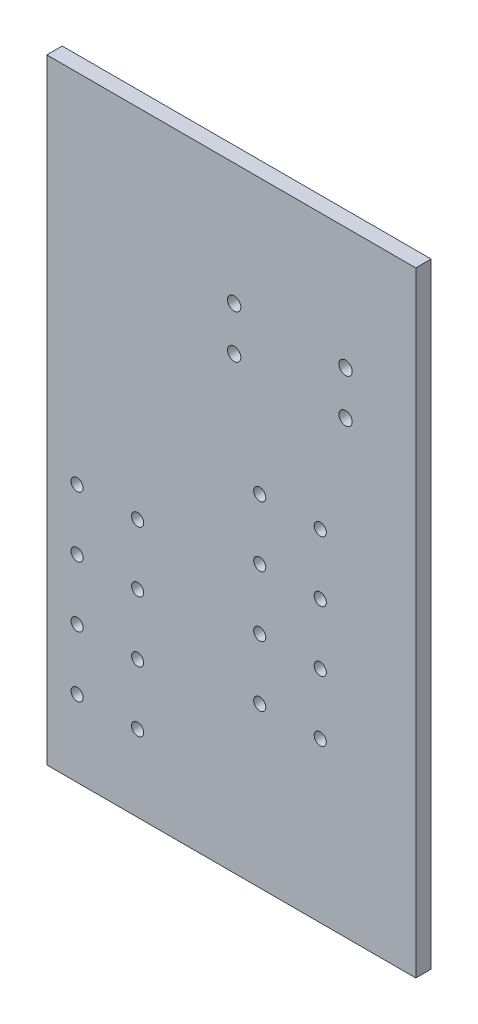
ISO-10303-21;
HEADER;
FILE_DESCRIPTION(('STEP AP214'),'2;1');
FILE_NAME('part.step','',(''),(''),'','','');
FILE_SCHEMA(('AUTOMOTIVE_DESIGN { 1 0 10303 214 1 1 1 1 }'));
ENDSEC;
DATA;
#1=APPLICATION_CONTEXT('core data for automotive mechanical design processes');
#2=APPLICATION_PROTOCOL_DEFINITION('international standard','automotive_design',2000,#1);
#3=PRODUCT_CONTEXT('',#1,'mechanical');
#4=PRODUCT('Part','Part','',(#3));
#5=PRODUCT_RELATED_PRODUCT_CATEGORY('part','',(#4));
#6=PRODUCT_DEFINITION_FORMATION('','',#4);
#7=PRODUCT_DEFINITION_CONTEXT('part definition',#1,'design');
#8=PRODUCT_DEFINITION('design','',#6,#7);
#9=PRODUCT_DEFINITION_SHAPE('','',#8);
#10=(LENGTH_UNIT() NAMED_UNIT(*) SI_UNIT(.MILLI.,.METRE.));
#11=(NAMED_UNIT(*) PLANE_ANGLE_UNIT() SI_UNIT($,.RADIAN.));
#12=(NAMED_UNIT(*) SI_UNIT($,.STERADIAN.) SOLID_ANGLE_UNIT());
#13=UNCERTAINTY_MEASURE_WITH_UNIT(LENGTH_MEASURE(1.E-05),#10,'distance_accuracy_value','');
#14=(GEOMETRIC_REPRESENTATION_CONTEXT(3) GLOBAL_UNCERTAINTY_ASSIGNED_CONTEXT((#13)) GLOBAL_UNIT_ASSIGNED_CONTEXT((#10,
#11,#12)) REPRESENTATION_CONTEXT('',''));
#15=CARTESIAN_POINT('',(0.,0.,0.));
#16=DIRECTION('',(0.,0.,1.));
#17=DIRECTION('',(1.,0.,0.));
#18=AXIS2_PLACEMENT_3D('',#15,#16,#17);
#19=CARTESIAN_POINT('',(76.2,127.,6.35));
#20=DIRECTION('',(-1.,0.,0.));
#21=DIRECTION('',(0.,-1.,0.));
#22=AXIS2_PLACEMENT_3D('',#19,#20,#21);
#23=PLANE('',#22);
#24=DIRECTION('',(0.,1.,0.));
#25=VECTOR('',#24,1.);
#26=CARTESIAN_POINT('',(76.2,127.,0.));
#27=LINE('',#26,#25);
#28=CARTESIAN_POINT('',(76.2,-127.,0.));
#29=VERTEX_POINT('',#28);
#30=CARTESIAN_POINT('',(76.2,127.,0.));
#31=VERTEX_POINT('',#30);
#32=EDGE_CURVE('E96',#29,#31,#27,.T.);
#33=ORIENTED_EDGE('',*,*,#32,.T.);
#34=DIRECTION('',(0.,0.,-1.));
#35=VECTOR('',#34,1.);
#36=CARTESIAN_POINT('',(76.2,127.,6.35));
#37=LINE('',#36,#35);
#38=CARTESIAN_POINT('',(76.2,127.,6.35));
#39=VERTEX_POINT('',#38);
#40=EDGE_CURVE('E11',#39,#31,#37,.T.);
#41=ORIENTED_EDGE('',*,*,#40,.F.);
#42=DIRECTION('',(0.,1.,0.));
#43=VECTOR('',#42,1.);
#44=CARTESIAN_POINT('',(76.2,127.,6.35));
#45=LINE('',#44,#43);
#46=CARTESIAN_POINT('',(76.2,-127.,6.35));
#47=VERTEX_POINT('',#46);
#48=EDGE_CURVE('E84',#47,#39,#45,.T.);
#49=ORIENTED_EDGE('',*,*,#48,.F.);
#50=DIRECTION('',(0.,0.,-1.));
#51=VECTOR('',#50,1.);
#52=CARTESIAN_POINT('',(76.2,-127.,6.35));
#53=LINE('',#52,#51);
#54=EDGE_CURVE('E92',#47,#29,#53,.T.);
#55=ORIENTED_EDGE('',*,*,#54,.T.);
#56=EDGE_LOOP('',(#33,#41,#49,#55));
#57=FACE_BOUND('',#56,.T.);
#58=ADVANCED_FACE('F33',(#57),#23,.F.);
#59=CARTESIAN_POINT('',(-76.2,127.,6.35));
#60=DIRECTION('',(0.,-1.,0.));
#61=DIRECTION('',(0.,0.,-1.));
#62=AXIS2_PLACEMENT_3D('',#59,#60,#61);
#63=PLANE('',#62);
#64=DIRECTION('',(-1.,0.,0.));
#65=VECTOR('',#64,1.);
#66=CARTESIAN_POINT('',(-76.2,127.,0.));
#67=LINE('',#66,#65);
#68=CARTESIAN_POINT('',(-76.2,127.,0.));
#69=VERTEX_POINT('',#68);
#70=EDGE_CURVE('E88',#31,#69,#67,.T.);
#71=ORIENTED_EDGE('',*,*,#70,.T.);
#72=DIRECTION('',(0.,0.,-1.));
#73=VECTOR('',#72,1.);
#74=CARTESIAN_POINT('',(-76.2,127.,6.35));
#75=LINE('',#74,#73);
#76=CARTESIAN_POINT('',(-76.2,127.,6.35));
#77=VERTEX_POINT('',#76);
#78=EDGE_CURVE('E41',#77,#69,#75,.T.);
#79=ORIENTED_EDGE('',*,*,#78,.F.);
#80=DIRECTION('',(-1.,0.,0.));
#81=VECTOR('',#80,1.);
#82=CARTESIAN_POINT('',(-76.2,127.,6.35));
#83=LINE('',#82,#81);
#84=EDGE_CURVE('E79',#39,#77,#83,.T.);
#85=ORIENTED_EDGE('',*,*,#84,.F.);
#86=ORIENTED_EDGE('',*,*,#40,.T.);
#87=EDGE_LOOP('',(#71,#79,#85,#86));
#88=FACE_BOUND('',#87,.T.);
#89=ADVANCED_FACE('F87',(#88),#63,.F.);
#90=CARTESIAN_POINT('',(-76.2,127.,6.35));
#91=DIRECTION('',(1.,0.,0.));
#92=DIRECTION('',(0.,1.,0.));
#93=AXIS2_PLACEMENT_3D('',#90,#91,#92);
#94=PLANE('',#93);
#95=DIRECTION('',(0.,-1.,0.));
#96=VECTOR('',#95,1.);
#97=CARTESIAN_POINT('',(-76.2,127.,0.));
#98=LINE('',#97,#96);
#99=CARTESIAN_POINT('',(-76.2,-127.,0.));
#100=VERTEX_POINT('',#99);
#101=EDGE_CURVE('E66',#69,#100,#98,.T.);
#102=ORIENTED_EDGE('',*,*,#101,.T.);
#103=DIRECTION('',(0.,0.,-1.));
#104=VECTOR('',#103,1.);
#105=CARTESIAN_POINT('',(-76.2,-127.,6.35));
#106=LINE('',#105,#104);
#107=CARTESIAN_POINT('',(-76.2,-127.,6.35));
#108=VERTEX_POINT('',#107);
#109=EDGE_CURVE('E89',#108,#100,#106,.T.);
#110=ORIENTED_EDGE('',*,*,#109,.F.);
#111=DIRECTION('',(0.,-1.,0.));
#112=VECTOR('',#111,1.);
#113=CARTESIAN_POINT('',(-76.2,127.,6.35));
#114=LINE('',#113,#112);
#115=EDGE_CURVE('E82',#77,#108,#114,.T.);
#116=ORIENTED_EDGE('',*,*,#115,.F.);
#117=ORIENTED_EDGE('',*,*,#78,.T.);
#118=EDGE_LOOP('',(#102,#110,#116,#117));
#119=FACE_BOUND('',#118,.T.);
#120=ADVANCED_FACE('F90',(#119),#94,.F.);
#121=CARTESIAN_POINT('',(-76.2,-127.,6.35));
#122=DIRECTION('',(0.,1.,0.));
#123=DIRECTION('',(0.,0.,1.));
#124=AXIS2_PLACEMENT_3D('',#121,#122,#123);
#125=PLANE('',#124);
#126=DIRECTION('',(1.,0.,0.));
#127=VECTOR('',#126,1.);
#128=CARTESIAN_POINT('',(-76.2,-127.,0.));
#129=LINE('',#128,#127);
#130=EDGE_CURVE('E72',#100,#29,#129,.T.);
#131=ORIENTED_EDGE('',*,*,#130,.T.);
#132=ORIENTED_EDGE('',*,*,#54,.F.);
#133=DIRECTION('',(1.,0.,0.));
#134=VECTOR('',#133,1.);
#135=CARTESIAN_POINT('',(-76.2,-127.,6.35));
#136=LINE('',#135,#134);
#137=EDGE_CURVE('E49',#108,#47,#136,.T.);
#138=ORIENTED_EDGE('',*,*,#137,.F.);
#139=ORIENTED_EDGE('',*,*,#109,.T.);
#140=EDGE_LOOP('',(#131,#132,#138,#139));
#141=FACE_BOUND('',#140,.T.);
#142=ADVANCED_FACE('F104',(#141),#125,.F.);
#143=CARTESIAN_POINT('',(0.,0.,6.35));
#144=DIRECTION('',(0.,0.,1.));
#145=DIRECTION('',(1.,0.,0.));
#146=AXIS2_PLACEMENT_3D('',#143,#144,#145);
#147=PLANE('',#146);
#148=CARTESIAN_POINT('',(1.180499962001,76.7624024018385,6.35));
#149=DIRECTION('',(0.,0.,1.));
#150=DIRECTION('',(1.,0.,0.));
#151=AXIS2_PLACEMENT_3D('',#148,#149,#150);
#152=CIRCLE('',#151,2.75);
#153=CARTESIAN_POINT('',(3.930499962001,76.7624024018385,6.35));
#154=VERTEX_POINT('',#153);
#155=EDGE_CURVE('E224',#154,#154,#152,.F.);
#156=ORIENTED_EDGE('',*,*,#155,.T.);
#157=EDGE_LOOP('',(#156));
#158=FACE_BOUND('',#157,.T.);
#159=CARTESIAN_POINT('',(47.180499962001,76.7624024018386,6.35));
#160=DIRECTION('',(0.,0.,1.));
#161=DIRECTION('',(1.,0.,0.));
#162=AXIS2_PLACEMENT_3D('',#159,#160,#161);
#163=CIRCLE('',#162,2.74999999999999);
#164=CARTESIAN_POINT('',(49.930499962001,76.7624024018386,6.35));
#165=VERTEX_POINT('',#164);
#166=EDGE_CURVE('E218',#165,#165,#163,.F.);
#167=ORIENTED_EDGE('',*,*,#166,.T.);
#168=EDGE_LOOP('',(#167));
#169=FACE_BOUND('',#168,.T.);
#170=CARTESIAN_POINT('',(1.180499962001,58.7624024018386,6.35));
#171=DIRECTION('',(0.,0.,1.));
#172=DIRECTION('',(1.,0.,0.));
#173=AXIS2_PLACEMENT_3D('',#170,#171,#172);
#174=CIRCLE('',#173,2.75);
#175=CARTESIAN_POINT('',(3.930499962001,58.7624024018386,6.35));
#176=VERTEX_POINT('',#175);
#177=EDGE_CURVE('E212',#176,#176,#174,.F.);
#178=ORIENTED_EDGE('',*,*,#177,.T.);
#179=EDGE_LOOP('',(#178));
#180=FACE_BOUND('',#179,.T.);
#181=CARTESIAN_POINT('',(47.180499962001,58.7624024018386,6.35));
#182=DIRECTION('',(0.,0.,1.));
#183=DIRECTION('',(1.,0.,0.));
#184=AXIS2_PLACEMENT_3D('',#181,#182,#183);
#185=CIRCLE('',#184,2.74999999999999);
#186=CARTESIAN_POINT('',(49.930499962001,58.7624024018386,6.35));
#187=VERTEX_POINT('',#186);
#188=EDGE_CURVE('E206',#187,#187,#185,.F.);
#189=ORIENTED_EDGE('',*,*,#188,.T.);
#190=EDGE_LOOP('',(#189));
#191=FACE_BOUND('',#190,.T.);
#192=CARTESIAN_POINT('',(11.7379999999995,13.8400000000015,6.35));
#193=DIRECTION('',(0.,0.,1.));
#194=DIRECTION('',(1.,0.,0.));
#195=AXIS2_PLACEMENT_3D('',#192,#193,#194);
#196=CIRCLE('',#195,2.49999999999917);
#197=CARTESIAN_POINT('',(14.2379999999987,13.8400000000015,6.35));
#198=VERTEX_POINT('',#197);
#199=EDGE_CURVE('E200',#198,#198,#196,.F.);
#200=ORIENTED_EDGE('',*,*,#199,.T.);
#201=EDGE_LOOP('',(#200));
#202=FACE_BOUND('',#201,.T.);
#203=CARTESIAN_POINT('',(36.7379999999995,13.8400000000015,6.35));
#204=DIRECTION('',(0.,0.,1.));
#205=DIRECTION('',(1.,0.,0.));
#206=AXIS2_PLACEMENT_3D('',#203,#204,#205);
#207=CIRCLE('',#206,2.49999999999917);
#208=CARTESIAN_POINT('',(39.2379999999987,13.8400000000015,6.35));
#209=VERTEX_POINT('',#208);
#210=EDGE_CURVE('E194',#209,#209,#207,.F.);
#211=ORIENTED_EDGE('',*,*,#210,.T.);
#212=EDGE_LOOP('',(#211));
#213=FACE_BOUND('',#212,.T.);
#214=CARTESIAN_POINT('',(36.7379999999995,-11.1599999999985,6.35));
#215=DIRECTION('',(0.,0.,1.));
#216=DIRECTION('',(1.,0.,0.));
#217=AXIS2_PLACEMENT_3D('',#214,#215,#216);
#218=CIRCLE('',#217,2.49999999999916);
#219=CARTESIAN_POINT('',(39.2379999999987,-11.1599999999985,6.35));
#220=VERTEX_POINT('',#219);
#221=EDGE_CURVE('E188',#220,#220,#218,.F.);
#222=ORIENTED_EDGE('',*,*,#221,.T.);
#223=EDGE_LOOP('',(#222));
#224=FACE_BOUND('',#223,.T.);
#225=CARTESIAN_POINT('',(11.7379999999995,-11.1599999999985,6.35));
#226=DIRECTION('',(0.,0.,1.));
#227=DIRECTION('',(1.,0.,0.));
#228=AXIS2_PLACEMENT_3D('',#225,#226,#227);
#229=CIRCLE('',#228,2.49999999999917);
#230=CARTESIAN_POINT('',(14.2379999999987,-11.1599999999985,6.35));
#231=VERTEX_POINT('',#230);
#232=EDGE_CURVE('E182',#231,#231,#229,.F.);
#233=ORIENTED_EDGE('',*,*,#232,.T.);
#234=EDGE_LOOP('',(#233));
#235=FACE_BOUND('',#234,.T.);
#236=CARTESIAN_POINT('',(36.7379999999995,-36.1599999999985,6.35));
#237=DIRECTION('',(0.,0.,1.));
#238=DIRECTION('',(1.,0.,0.));
#239=AXIS2_PLACEMENT_3D('',#236,#237,#238);
#240=CIRCLE('',#239,2.49999999999917);
#241=CARTESIAN_POINT('',(39.2379999999987,-36.1599999999985,6.35));
#242=VERTEX_POINT('',#241);
#243=EDGE_CURVE('E176',#242,#242,#240,.F.);
#244=ORIENTED_EDGE('',*,*,#243,.T.);
#245=EDGE_LOOP('',(#244));
#246=FACE_BOUND('',#245,.T.);
#247=CARTESIAN_POINT('',(36.7379999999995,-61.1599999999985,6.35));
#248=DIRECTION('',(0.,0.,1.));
#249=DIRECTION('',(1.,0.,0.));
#250=AXIS2_PLACEMENT_3D('',#247,#248,#249);
#251=CIRCLE('',#250,2.49999999999918);
#252=CARTESIAN_POINT('',(39.2379999999987,-61.1599999999985,6.35));
#253=VERTEX_POINT('',#252);
#254=EDGE_CURVE('E170',#253,#253,#251,.F.);
#255=ORIENTED_EDGE('',*,*,#254,.T.);
#256=EDGE_LOOP('',(#255));
#257=FACE_BOUND('',#256,.T.);
#258=CARTESIAN_POINT('',(11.7379999999995,-36.1599999999985,6.35));
#259=DIRECTION('',(0.,0.,1.));
#260=DIRECTION('',(1.,0.,0.));
#261=AXIS2_PLACEMENT_3D('',#258,#259,#260);
#262=CIRCLE('',#261,2.49999999999917);
#263=CARTESIAN_POINT('',(14.2379999999987,-36.1599999999985,6.35));
#264=VERTEX_POINT('',#263);
#265=EDGE_CURVE('E164',#264,#264,#262,.F.);
#266=ORIENTED_EDGE('',*,*,#265,.T.);
#267=EDGE_LOOP('',(#266));
#268=FACE_BOUND('',#267,.T.);
#269=CARTESIAN_POINT('',(11.7379999999995,-61.1599999999985,6.35));
#270=DIRECTION('',(0.,0.,1.));
#271=DIRECTION('',(1.,0.,0.));
#272=AXIS2_PLACEMENT_3D('',#269,#270,#271);
#273=CIRCLE('',#272,2.49999999999917);
#274=CARTESIAN_POINT('',(14.2379999999987,-61.1599999999985,6.35));
#275=VERTEX_POINT('',#274);
#276=EDGE_CURVE('E158',#275,#275,#273,.F.);
#277=ORIENTED_EDGE('',*,*,#276,.T.);
#278=EDGE_LOOP('',(#277));
#279=FACE_BOUND('',#278,.T.);
#280=CARTESIAN_POINT('',(-63.7000000000001,-95.449999999997,6.35));
#281=DIRECTION('',(0.,0.,1.));
#282=DIRECTION('',(1.,0.,0.));
#283=AXIS2_PLACEMENT_3D('',#280,#281,#282);
#284=CIRCLE('',#283,2.49999999999995);
#285=CARTESIAN_POINT('',(-61.2000000000002,-95.449999999997,6.35));
#286=VERTEX_POINT('',#285);
#287=EDGE_CURVE('E152',#286,#286,#284,.F.);
#288=ORIENTED_EDGE('',*,*,#287,.T.);
#289=EDGE_LOOP('',(#288));
#290=FACE_BOUND('',#289,.T.);
#291=CARTESIAN_POINT('',(-38.7000000000001,-95.449999999997,6.35));
#292=DIRECTION('',(0.,0.,1.));
#293=DIRECTION('',(1.,0.,0.));
#294=AXIS2_PLACEMENT_3D('',#291,#292,#293);
#295=CIRCLE('',#294,2.49999999999995);
#296=CARTESIAN_POINT('',(-36.2000000000002,-95.449999999997,6.35));
#297=VERTEX_POINT('',#296);
#298=EDGE_CURVE('E146',#297,#297,#295,.F.);
#299=ORIENTED_EDGE('',*,*,#298,.T.);
#300=EDGE_LOOP('',(#299));
#301=FACE_BOUND('',#300,.T.);
#302=CARTESIAN_POINT('',(-38.7000000000001,-70.449999999997,6.35));
#303=DIRECTION('',(0.,0.,1.));
#304=DIRECTION('',(1.,0.,0.));
#305=AXIS2_PLACEMENT_3D('',#302,#303,#304);
#306=CIRCLE('',#305,2.49999999999994);
#307=CARTESIAN_POINT('',(-36.2000000000002,-70.449999999997,6.35));
#308=VERTEX_POINT('',#307);
#309=EDGE_CURVE('E140',#308,#308,#306,.F.);
#310=ORIENTED_EDGE('',*,*,#309,.T.);
#311=EDGE_LOOP('',(#310));
#312=FACE_BOUND('',#311,.T.);
#313=CARTESIAN_POINT('',(-63.7000000000001,-70.449999999997,6.35));
#314=DIRECTION('',(0.,0.,1.));
#315=DIRECTION('',(1.,0.,0.));
#316=AXIS2_PLACEMENT_3D('',#313,#314,#315);
#317=CIRCLE('',#316,2.49999999999995);
#318=CARTESIAN_POINT('',(-61.2000000000002,-70.449999999997,6.35));
#319=VERTEX_POINT('',#318);
#320=EDGE_CURVE('E134',#319,#319,#317,.F.);
#321=ORIENTED_EDGE('',*,*,#320,.T.);
#322=EDGE_LOOP('',(#321));
#323=FACE_BOUND('',#322,.T.);
#324=CARTESIAN_POINT('',(-63.7000000000001,-45.449999999997,6.35));
#325=DIRECTION('',(0.,0.,1.));
#326=DIRECTION('',(1.,0.,0.));
#327=AXIS2_PLACEMENT_3D('',#324,#325,#326);
#328=CIRCLE('',#327,2.49999999999995);
#329=CARTESIAN_POINT('',(-61.2000000000002,-45.449999999997,6.35));
#330=VERTEX_POINT('',#329);
#331=EDGE_CURVE('E128',#330,#330,#328,.F.);
#332=ORIENTED_EDGE('',*,*,#331,.T.);
#333=EDGE_LOOP('',(#332));
#334=FACE_BOUND('',#333,.T.);
#335=CARTESIAN_POINT('',(-38.7000000000001,-45.449999999997,6.35));
#336=DIRECTION('',(0.,0.,1.));
#337=DIRECTION('',(1.,0.,0.));
#338=AXIS2_PLACEMENT_3D('',#335,#336,#337);
#339=CIRCLE('',#338,2.49999999999994);
#340=CARTESIAN_POINT('',(-36.2000000000002,-45.449999999997,6.35));
#341=VERTEX_POINT('',#340);
#342=EDGE_CURVE('E122',#341,#341,#339,.F.);
#343=ORIENTED_EDGE('',*,*,#342,.T.);
#344=EDGE_LOOP('',(#343));
#345=FACE_BOUND('',#344,.T.);
#346=CARTESIAN_POINT('',(-38.7000000000001,-20.449999999997,6.35));
#347=DIRECTION('',(0.,0.,1.));
#348=DIRECTION('',(1.,0.,0.));
#349=AXIS2_PLACEMENT_3D('',#346,#347,#348);
#350=CIRCLE('',#349,2.49999999999994);
#351=CARTESIAN_POINT('',(-36.2000000000002,-20.449999999997,6.35));
#352=VERTEX_POINT('',#351);
#353=EDGE_CURVE('E116',#352,#352,#350,.F.);
#354=ORIENTED_EDGE('',*,*,#353,.T.);
#355=EDGE_LOOP('',(#354));
#356=FACE_BOUND('',#355,.T.);
#357=CARTESIAN_POINT('',(-63.7000000000001,-20.449999999997,6.35));
#358=DIRECTION('',(0.,0.,1.));
#359=DIRECTION('',(1.,0.,0.));
#360=AXIS2_PLACEMENT_3D('',#357,#358,#359);
#361=CIRCLE('',#360,2.49999999999995);
#362=CARTESIAN_POINT('',(-61.2000000000002,-20.449999999997,6.35));
#363=VERTEX_POINT('',#362);
#364=EDGE_CURVE('E110',#363,#363,#361,.F.);
#365=ORIENTED_EDGE('',*,*,#364,.T.);
#366=EDGE_LOOP('',(#365));
#367=FACE_BOUND('',#366,.T.);
#368=ORIENTED_EDGE('',*,*,#48,.T.);
#369=ORIENTED_EDGE('',*,*,#84,.T.);
#370=ORIENTED_EDGE('',*,*,#115,.T.);
#371=ORIENTED_EDGE('',*,*,#137,.T.);
#372=EDGE_LOOP('',(#368,#369,#370,#371));
#373=FACE_BOUND('',#372,.T.);
#374=ADVANCED_FACE('F80',(#158,#169,#180,#191,#202,#213,#224,#235,#246,#257,#268,#279,#290,#301,
#312,#323,#334,#345,#356,#367,#373),#147,.T.);
#375=CARTESIAN_POINT('',(0.,0.,0.));
#376=DIRECTION('',(0.,0.,1.));
#377=DIRECTION('',(1.,0.,0.));
#378=AXIS2_PLACEMENT_3D('',#375,#376,#377);
#379=PLANE('',#378);
#380=CARTESIAN_POINT('',(1.180499962001,76.7624024018385,0.));
#381=DIRECTION('',(0.,0.,-1.));
#382=DIRECTION('',(-1.,0.,0.));
#383=AXIS2_PLACEMENT_3D('',#380,#381,#382);
#384=CIRCLE('',#383,2.75);
#385=CARTESIAN_POINT('',(-1.56950003799899,76.7624024018385,0.));
#386=VERTEX_POINT('',#385);
#387=EDGE_CURVE('E221',#386,#386,#384,.T.);
#388=ORIENTED_EDGE('',*,*,#387,.F.);
#389=EDGE_LOOP('',(#388));
#390=FACE_BOUND('',#389,.T.);
#391=CARTESIAN_POINT('',(47.180499962001,76.7624024018386,0.));
#392=DIRECTION('',(0.,0.,-1.));
#393=DIRECTION('',(-1.,0.,0.));
#394=AXIS2_PLACEMENT_3D('',#391,#392,#393);
#395=CIRCLE('',#394,2.74999999999999);
#396=CARTESIAN_POINT('',(44.430499962001,76.7624024018386,0.));
#397=VERTEX_POINT('',#396);
#398=EDGE_CURVE('E215',#397,#397,#395,.T.);
#399=ORIENTED_EDGE('',*,*,#398,.F.);
#400=EDGE_LOOP('',(#399));
#401=FACE_BOUND('',#400,.T.);
#402=CARTESIAN_POINT('',(1.180499962001,58.7624024018386,0.));
#403=DIRECTION('',(0.,0.,-1.));
#404=DIRECTION('',(-1.,0.,0.));
#405=AXIS2_PLACEMENT_3D('',#402,#403,#404);
#406=CIRCLE('',#405,2.75);
#407=CARTESIAN_POINT('',(-1.56950003799899,58.7624024018386,0.));
#408=VERTEX_POINT('',#407);
#409=EDGE_CURVE('E209',#408,#408,#406,.T.);
#410=ORIENTED_EDGE('',*,*,#409,.F.);
#411=EDGE_LOOP('',(#410));
#412=FACE_BOUND('',#411,.T.);
#413=CARTESIAN_POINT('',(47.180499962001,58.7624024018386,0.));
#414=DIRECTION('',(0.,0.,-1.));
#415=DIRECTION('',(-1.,0.,0.));
#416=AXIS2_PLACEMENT_3D('',#413,#414,#415);
#417=CIRCLE('',#416,2.74999999999999);
#418=CARTESIAN_POINT('',(44.430499962001,58.7624024018386,0.));
#419=VERTEX_POINT('',#418);
#420=EDGE_CURVE('E203',#419,#419,#417,.T.);
#421=ORIENTED_EDGE('',*,*,#420,.F.);
#422=EDGE_LOOP('',(#421));
#423=FACE_BOUND('',#422,.T.);
#424=CARTESIAN_POINT('',(11.7379999999995,13.8400000000015,0.));
#425=DIRECTION('',(0.,0.,-1.));
#426=DIRECTION('',(-1.,0.,0.));
#427=AXIS2_PLACEMENT_3D('',#424,#425,#426);
#428=CIRCLE('',#427,2.49999999999917);
#429=CARTESIAN_POINT('',(9.23800000000037,13.8400000000015,0.));
#430=VERTEX_POINT('',#429);
#431=EDGE_CURVE('E197',#430,#430,#428,.T.);
#432=ORIENTED_EDGE('',*,*,#431,.F.);
#433=EDGE_LOOP('',(#432));
#434=FACE_BOUND('',#433,.T.);
#435=CARTESIAN_POINT('',(36.7379999999995,13.8400000000015,0.));
#436=DIRECTION('',(0.,0.,-1.));
#437=DIRECTION('',(-1.,0.,0.));
#438=AXIS2_PLACEMENT_3D('',#435,#436,#437);
#439=CIRCLE('',#438,2.49999999999917);
#440=CARTESIAN_POINT('',(34.2380000000004,13.8400000000015,0.));
#441=VERTEX_POINT('',#440);
#442=EDGE_CURVE('E191',#441,#441,#439,.T.);
#443=ORIENTED_EDGE('',*,*,#442,.F.);
#444=EDGE_LOOP('',(#443));
#445=FACE_BOUND('',#444,.T.);
#446=CARTESIAN_POINT('',(36.7379999999995,-11.1599999999985,0.));
#447=DIRECTION('',(0.,0.,-1.));
#448=DIRECTION('',(-1.,0.,0.));
#449=AXIS2_PLACEMENT_3D('',#446,#447,#448);
#450=CIRCLE('',#449,2.49999999999916);
#451=CARTESIAN_POINT('',(34.2380000000004,-11.1599999999985,0.));
#452=VERTEX_POINT('',#451);
#453=EDGE_CURVE('E185',#452,#452,#450,.T.);
#454=ORIENTED_EDGE('',*,*,#453,.F.);
#455=EDGE_LOOP('',(#454));
#456=FACE_BOUND('',#455,.T.);
#457=CARTESIAN_POINT('',(11.7379999999995,-11.1599999999985,0.));
#458=DIRECTION('',(0.,0.,-1.));
#459=DIRECTION('',(-1.,0.,0.));
#460=AXIS2_PLACEMENT_3D('',#457,#458,#459);
#461=CIRCLE('',#460,2.49999999999917);
#462=CARTESIAN_POINT('',(9.23800000000037,-11.1599999999985,0.));
#463=VERTEX_POINT('',#462);
#464=EDGE_CURVE('E179',#463,#463,#461,.T.);
#465=ORIENTED_EDGE('',*,*,#464,.F.);
#466=EDGE_LOOP('',(#465));
#467=FACE_BOUND('',#466,.T.);
#468=CARTESIAN_POINT('',(36.7379999999995,-36.1599999999985,0.));
#469=DIRECTION('',(0.,0.,-1.));
#470=DIRECTION('',(-1.,0.,0.));
#471=AXIS2_PLACEMENT_3D('',#468,#469,#470);
#472=CIRCLE('',#471,2.49999999999917);
#473=CARTESIAN_POINT('',(34.2380000000004,-36.1599999999985,0.));
#474=VERTEX_POINT('',#473);
#475=EDGE_CURVE('E173',#474,#474,#472,.T.);
#476=ORIENTED_EDGE('',*,*,#475,.F.);
#477=EDGE_LOOP('',(#476));
#478=FACE_BOUND('',#477,.T.);
#479=CARTESIAN_POINT('',(36.7379999999995,-61.1599999999985,0.));
#480=DIRECTION('',(0.,0.,-1.));
#481=DIRECTION('',(-1.,0.,0.));
#482=AXIS2_PLACEMENT_3D('',#479,#480,#481);
#483=CIRCLE('',#482,2.49999999999918);
#484=CARTESIAN_POINT('',(34.2380000000004,-61.1599999999985,0.));
#485=VERTEX_POINT('',#484);
#486=EDGE_CURVE('E167',#485,#485,#483,.T.);
#487=ORIENTED_EDGE('',*,*,#486,.F.);
#488=EDGE_LOOP('',(#487));
#489=FACE_BOUND('',#488,.T.);
#490=CARTESIAN_POINT('',(11.7379999999995,-36.1599999999985,0.));
#491=DIRECTION('',(0.,0.,-1.));
#492=DIRECTION('',(-1.,0.,0.));
#493=AXIS2_PLACEMENT_3D('',#490,#491,#492);
#494=CIRCLE('',#493,2.49999999999917);
#495=CARTESIAN_POINT('',(9.23800000000036,-36.1599999999985,0.));
#496=VERTEX_POINT('',#495);
#497=EDGE_CURVE('E161',#496,#496,#494,.T.);
#498=ORIENTED_EDGE('',*,*,#497,.F.);
#499=EDGE_LOOP('',(#498));
#500=FACE_BOUND('',#499,.T.);
#501=CARTESIAN_POINT('',(11.7379999999995,-61.1599999999985,0.));
#502=DIRECTION('',(0.,0.,-1.));
#503=DIRECTION('',(-1.,0.,0.));
#504=AXIS2_PLACEMENT_3D('',#501,#502,#503);
#505=CIRCLE('',#504,2.49999999999917);
#506=CARTESIAN_POINT('',(9.23800000000036,-61.1599999999985,0.));
#507=VERTEX_POINT('',#506);
#508=EDGE_CURVE('E155',#507,#507,#505,.T.);
#509=ORIENTED_EDGE('',*,*,#508,.F.);
#510=EDGE_LOOP('',(#509));
#511=FACE_BOUND('',#510,.T.);
#512=CARTESIAN_POINT('',(-63.7000000000001,-95.449999999997,0.));
#513=DIRECTION('',(0.,0.,-1.));
#514=DIRECTION('',(-1.,0.,0.));
#515=AXIS2_PLACEMENT_3D('',#512,#513,#514);
#516=CIRCLE('',#515,2.49999999999995);
#517=CARTESIAN_POINT('',(-66.2000000000001,-95.449999999997,0.));
#518=VERTEX_POINT('',#517);
#519=EDGE_CURVE('E149',#518,#518,#516,.T.);
#520=ORIENTED_EDGE('',*,*,#519,.F.);
#521=EDGE_LOOP('',(#520));
#522=FACE_BOUND('',#521,.T.);
#523=CARTESIAN_POINT('',(-38.7000000000001,-95.449999999997,0.));
#524=DIRECTION('',(0.,0.,-1.));
#525=DIRECTION('',(-1.,0.,0.));
#526=AXIS2_PLACEMENT_3D('',#523,#524,#525);
#527=CIRCLE('',#526,2.49999999999995);
#528=CARTESIAN_POINT('',(-41.2000000000001,-95.449999999997,0.));
#529=VERTEX_POINT('',#528);
#530=EDGE_CURVE('E143',#529,#529,#527,.T.);
#531=ORIENTED_EDGE('',*,*,#530,.F.);
#532=EDGE_LOOP('',(#531));
#533=FACE_BOUND('',#532,.T.);
#534=CARTESIAN_POINT('',(-38.7000000000001,-70.449999999997,0.));
#535=DIRECTION('',(0.,0.,-1.));
#536=DIRECTION('',(-1.,0.,0.));
#537=AXIS2_PLACEMENT_3D('',#534,#535,#536);
#538=CIRCLE('',#537,2.49999999999994);
#539=CARTESIAN_POINT('',(-41.2000000000001,-70.449999999997,0.));
#540=VERTEX_POINT('',#539);
#541=EDGE_CURVE('E137',#540,#540,#538,.T.);
#542=ORIENTED_EDGE('',*,*,#541,.F.);
#543=EDGE_LOOP('',(#542));
#544=FACE_BOUND('',#543,.T.);
#545=CARTESIAN_POINT('',(-63.7000000000001,-70.449999999997,0.));
#546=DIRECTION('',(0.,0.,-1.));
#547=DIRECTION('',(-1.,0.,0.));
#548=AXIS2_PLACEMENT_3D('',#545,#546,#547);
#549=CIRCLE('',#548,2.49999999999995);
#550=CARTESIAN_POINT('',(-66.2000000000001,-70.449999999997,0.));
#551=VERTEX_POINT('',#550);
#552=EDGE_CURVE('E131',#551,#551,#549,.T.);
#553=ORIENTED_EDGE('',*,*,#552,.F.);
#554=EDGE_LOOP('',(#553));
#555=FACE_BOUND('',#554,.T.);
#556=CARTESIAN_POINT('',(-63.7000000000001,-45.449999999997,0.));
#557=DIRECTION('',(0.,0.,-1.));
#558=DIRECTION('',(-1.,0.,0.));
#559=AXIS2_PLACEMENT_3D('',#556,#557,#558);
#560=CIRCLE('',#559,2.49999999999995);
#561=CARTESIAN_POINT('',(-66.2000000000001,-45.449999999997,0.));
#562=VERTEX_POINT('',#561);
#563=EDGE_CURVE('E125',#562,#562,#560,.T.);
#564=ORIENTED_EDGE('',*,*,#563,.F.);
#565=EDGE_LOOP('',(#564));
#566=FACE_BOUND('',#565,.T.);
#567=CARTESIAN_POINT('',(-38.7000000000001,-45.449999999997,0.));
#568=DIRECTION('',(0.,0.,-1.));
#569=DIRECTION('',(-1.,0.,0.));
#570=AXIS2_PLACEMENT_3D('',#567,#568,#569);
#571=CIRCLE('',#570,2.49999999999994);
#572=CARTESIAN_POINT('',(-41.2000000000001,-45.449999999997,0.));
#573=VERTEX_POINT('',#572);
#574=EDGE_CURVE('E119',#573,#573,#571,.T.);
#575=ORIENTED_EDGE('',*,*,#574,.F.);
#576=EDGE_LOOP('',(#575));
#577=FACE_BOUND('',#576,.T.);
#578=CARTESIAN_POINT('',(-38.7000000000001,-20.449999999997,0.));
#579=DIRECTION('',(0.,0.,-1.));
#580=DIRECTION('',(-1.,0.,0.));
#581=AXIS2_PLACEMENT_3D('',#578,#579,#580);
#582=CIRCLE('',#581,2.49999999999994);
#583=CARTESIAN_POINT('',(-41.2000000000001,-20.449999999997,0.));
#584=VERTEX_POINT('',#583);
#585=EDGE_CURVE('E113',#584,#584,#582,.T.);
#586=ORIENTED_EDGE('',*,*,#585,.F.);
#587=EDGE_LOOP('',(#586));
#588=FACE_BOUND('',#587,.T.);
#589=CARTESIAN_POINT('',(-63.7000000000001,-20.449999999997,0.));
#590=DIRECTION('',(0.,0.,-1.));
#591=DIRECTION('',(-1.,0.,0.));
#592=AXIS2_PLACEMENT_3D('',#589,#590,#591);
#593=CIRCLE('',#592,2.49999999999995);
#594=CARTESIAN_POINT('',(-66.2000000000001,-20.449999999997,0.));
#595=VERTEX_POINT('',#594);
#596=EDGE_CURVE('E99',#595,#595,#593,.T.);
#597=ORIENTED_EDGE('',*,*,#596,.F.);
#598=EDGE_LOOP('',(#597));
#599=FACE_BOUND('',#598,.T.);
#600=ORIENTED_EDGE('',*,*,#32,.F.);
#601=ORIENTED_EDGE('',*,*,#130,.F.);
#602=ORIENTED_EDGE('',*,*,#101,.F.);
#603=ORIENTED_EDGE('',*,*,#70,.F.);
#604=EDGE_LOOP('',(#600,#601,#602,#603));
#605=FACE_BOUND('',#604,.T.);
#606=ADVANCED_FACE('F107',(#390,#401,#412,#423,#434,#445,#456,#467,#478,#489,#500,#511,#522,
#533,#544,#555,#566,#577,#588,#599,#605),#379,.F.);
#607=CARTESIAN_POINT('',(-63.7000000000001,-20.449999999997,6.351));
#608=DIRECTION('',(0.,0.,-1.));
#609=DIRECTION('',(-1.,0.,0.));
#610=AXIS2_PLACEMENT_3D('',#607,#608,#609);
#611=CYLINDRICAL_SURFACE('',#610,2.49999999999995);
#612=ORIENTED_EDGE('',*,*,#364,.F.);
#613=EDGE_LOOP('',(#612));
#614=FACE_BOUND('',#613,.T.);
#615=ORIENTED_EDGE('',*,*,#596,.T.);
#616=EDGE_LOOP('',(#615));
#617=FACE_BOUND('',#616,.T.);
#618=ADVANCED_FACE('F234',(#614,#617),#611,.F.);
#619=CARTESIAN_POINT('',(-38.7000000000001,-20.449999999997,6.351));
#620=DIRECTION('',(0.,0.,-1.));
#621=DIRECTION('',(-1.,0.,0.));
#622=AXIS2_PLACEMENT_3D('',#619,#620,#621);
#623=CYLINDRICAL_SURFACE('',#622,2.49999999999994);
#624=ORIENTED_EDGE('',*,*,#353,.F.);
#625=EDGE_LOOP('',(#624));
#626=FACE_BOUND('',#625,.T.);
#627=ORIENTED_EDGE('',*,*,#585,.T.);
#628=EDGE_LOOP('',(#627));
#629=FACE_BOUND('',#628,.T.);
#630=ADVANCED_FACE('F275',(#626,#629),#623,.F.);
#631=CARTESIAN_POINT('',(-38.7000000000001,-45.449999999997,6.351));
#632=DIRECTION('',(0.,0.,-1.));
#633=DIRECTION('',(-1.,0.,0.));
#634=AXIS2_PLACEMENT_3D('',#631,#632,#633);
#635=CYLINDRICAL_SURFACE('',#634,2.49999999999994);
#636=ORIENTED_EDGE('',*,*,#342,.F.);
#637=EDGE_LOOP('',(#636));
#638=FACE_BOUND('',#637,.T.);
#639=ORIENTED_EDGE('',*,*,#574,.T.);
#640=EDGE_LOOP('',(#639));
#641=FACE_BOUND('',#640,.T.);
#642=ADVANCED_FACE('F282',(#638,#641),#635,.F.);
#643=CARTESIAN_POINT('',(-63.7000000000001,-45.449999999997,6.351));
#644=DIRECTION('',(0.,0.,-1.));
#645=DIRECTION('',(-1.,0.,0.));
#646=AXIS2_PLACEMENT_3D('',#643,#644,#645);
#647=CYLINDRICAL_SURFACE('',#646,2.49999999999995);
#648=ORIENTED_EDGE('',*,*,#331,.F.);
#649=EDGE_LOOP('',(#648));
#650=FACE_BOUND('',#649,.T.);
#651=ORIENTED_EDGE('',*,*,#563,.T.);
#652=EDGE_LOOP('',(#651));
#653=FACE_BOUND('',#652,.T.);
#654=ADVANCED_FACE('F344',(#650,#653),#647,.F.);
#655=CARTESIAN_POINT('',(-63.7000000000001,-70.449999999997,6.351));
#656=DIRECTION('',(0.,0.,-1.));
#657=DIRECTION('',(-1.,0.,0.));
#658=AXIS2_PLACEMENT_3D('',#655,#656,#657);
#659=CYLINDRICAL_SURFACE('',#658,2.49999999999995);
#660=ORIENTED_EDGE('',*,*,#320,.F.);
#661=EDGE_LOOP('',(#660));
#662=FACE_BOUND('',#661,.T.);
#663=ORIENTED_EDGE('',*,*,#552,.T.);
#664=EDGE_LOOP('',(#663));
#665=FACE_BOUND('',#664,.T.);
#666=ADVANCED_FACE('F349',(#662,#665),#659,.F.);
#667=CARTESIAN_POINT('',(-38.7000000000001,-70.449999999997,6.351));
#668=DIRECTION('',(0.,0.,-1.));
#669=DIRECTION('',(-1.,0.,0.));
#670=AXIS2_PLACEMENT_3D('',#667,#668,#669);
#671=CYLINDRICAL_SURFACE('',#670,2.49999999999994);
#672=ORIENTED_EDGE('',*,*,#309,.F.);
#673=EDGE_LOOP('',(#672));
#674=FACE_BOUND('',#673,.T.);
#675=ORIENTED_EDGE('',*,*,#541,.T.);
#676=EDGE_LOOP('',(#675));
#677=FACE_BOUND('',#676,.T.);
#678=ADVANCED_FACE('F355',(#674,#677),#671,.F.);
#679=CARTESIAN_POINT('',(-38.7000000000001,-95.449999999997,6.351));
#680=DIRECTION('',(0.,0.,-1.));
#681=DIRECTION('',(-1.,0.,0.));
#682=AXIS2_PLACEMENT_3D('',#679,#680,#681);
#683=CYLINDRICAL_SURFACE('',#682,2.49999999999995);
#684=ORIENTED_EDGE('',*,*,#298,.F.);
#685=EDGE_LOOP('',(#684));
#686=FACE_BOUND('',#685,.T.);
#687=ORIENTED_EDGE('',*,*,#530,.T.);
#688=EDGE_LOOP('',(#687));
#689=FACE_BOUND('',#688,.T.);
#690=ADVANCED_FACE('F359',(#686,#689),#683,.F.);
#691=CARTESIAN_POINT('',(-63.7000000000001,-95.449999999997,6.351));
#692=DIRECTION('',(0.,0.,-1.));
#693=DIRECTION('',(-1.,0.,0.));
#694=AXIS2_PLACEMENT_3D('',#691,#692,#693);
#695=CYLINDRICAL_SURFACE('',#694,2.49999999999995);
#696=ORIENTED_EDGE('',*,*,#287,.F.);
#697=EDGE_LOOP('',(#696));
#698=FACE_BOUND('',#697,.T.);
#699=ORIENTED_EDGE('',*,*,#519,.T.);
#700=EDGE_LOOP('',(#699));
#701=FACE_BOUND('',#700,.T.);
#702=ADVANCED_FACE('F363',(#698,#701),#695,.F.);
#703=CARTESIAN_POINT('',(11.7379999999995,-61.1599999999985,6.351));
#704=DIRECTION('',(0.,0.,-1.));
#705=DIRECTION('',(-1.,0.,0.));
#706=AXIS2_PLACEMENT_3D('',#703,#704,#705);
#707=CYLINDRICAL_SURFACE('',#706,2.49999999999917);
#708=ORIENTED_EDGE('',*,*,#276,.F.);
#709=EDGE_LOOP('',(#708));
#710=FACE_BOUND('',#709,.T.);
#711=ORIENTED_EDGE('',*,*,#508,.T.);
#712=EDGE_LOOP('',(#711));
#713=FACE_BOUND('',#712,.T.);
#714=ADVANCED_FACE('F367',(#710,#713),#707,.F.);
#715=CARTESIAN_POINT('',(11.7379999999995,-36.1599999999985,6.351));
#716=DIRECTION('',(0.,0.,-1.));
#717=DIRECTION('',(-1.,0.,0.));
#718=AXIS2_PLACEMENT_3D('',#715,#716,#717);
#719=CYLINDRICAL_SURFACE('',#718,2.49999999999917);
#720=ORIENTED_EDGE('',*,*,#265,.F.);
#721=EDGE_LOOP('',(#720));
#722=FACE_BOUND('',#721,.T.);
#723=ORIENTED_EDGE('',*,*,#497,.T.);
#724=EDGE_LOOP('',(#723));
#725=FACE_BOUND('',#724,.T.);
#726=ADVANCED_FACE('F371',(#722,#725),#719,.F.);
#727=CARTESIAN_POINT('',(36.7379999999995,-61.1599999999985,6.351));
#728=DIRECTION('',(0.,0.,-1.));
#729=DIRECTION('',(-1.,0.,0.));
#730=AXIS2_PLACEMENT_3D('',#727,#728,#729);
#731=CYLINDRICAL_SURFACE('',#730,2.49999999999918);
#732=ORIENTED_EDGE('',*,*,#254,.F.);
#733=EDGE_LOOP('',(#732));
#734=FACE_BOUND('',#733,.T.);
#735=ORIENTED_EDGE('',*,*,#486,.T.);
#736=EDGE_LOOP('',(#735));
#737=FACE_BOUND('',#736,.T.);
#738=ADVANCED_FACE('F375',(#734,#737),#731,.F.);
#739=CARTESIAN_POINT('',(36.7379999999995,-36.1599999999985,6.351));
#740=DIRECTION('',(0.,0.,-1.));
#741=DIRECTION('',(-1.,0.,0.));
#742=AXIS2_PLACEMENT_3D('',#739,#740,#741);
#743=CYLINDRICAL_SURFACE('',#742,2.49999999999917);
#744=ORIENTED_EDGE('',*,*,#243,.F.);
#745=EDGE_LOOP('',(#744));
#746=FACE_BOUND('',#745,.T.);
#747=ORIENTED_EDGE('',*,*,#475,.T.);
#748=EDGE_LOOP('',(#747));
#749=FACE_BOUND('',#748,.T.);
#750=ADVANCED_FACE('F379',(#746,#749),#743,.F.);
#751=CARTESIAN_POINT('',(11.7379999999995,-11.1599999999985,6.351));
#752=DIRECTION('',(0.,0.,-1.));
#753=DIRECTION('',(-1.,0.,0.));
#754=AXIS2_PLACEMENT_3D('',#751,#752,#753);
#755=CYLINDRICAL_SURFACE('',#754,2.49999999999917);
#756=ORIENTED_EDGE('',*,*,#232,.F.);
#757=EDGE_LOOP('',(#756));
#758=FACE_BOUND('',#757,.T.);
#759=ORIENTED_EDGE('',*,*,#464,.T.);
#760=EDGE_LOOP('',(#759));
#761=FACE_BOUND('',#760,.T.);
#762=ADVANCED_FACE('F383',(#758,#761),#755,.F.);
#763=CARTESIAN_POINT('',(36.7379999999995,-11.1599999999985,6.351));
#764=DIRECTION('',(0.,0.,-1.));
#765=DIRECTION('',(-1.,0.,0.));
#766=AXIS2_PLACEMENT_3D('',#763,#764,#765);
#767=CYLINDRICAL_SURFACE('',#766,2.49999999999916);
#768=ORIENTED_EDGE('',*,*,#221,.F.);
#769=EDGE_LOOP('',(#768));
#770=FACE_BOUND('',#769,.T.);
#771=ORIENTED_EDGE('',*,*,#453,.T.);
#772=EDGE_LOOP('',(#771));
#773=FACE_BOUND('',#772,.T.);
#774=ADVANCED_FACE('F387',(#770,#773),#767,.F.);
#775=CARTESIAN_POINT('',(36.7379999999995,13.8400000000015,6.351));
#776=DIRECTION('',(0.,0.,-1.));
#777=DIRECTION('',(-1.,0.,0.));
#778=AXIS2_PLACEMENT_3D('',#775,#776,#777);
#779=CYLINDRICAL_SURFACE('',#778,2.49999999999917);
#780=ORIENTED_EDGE('',*,*,#210,.F.);
#781=EDGE_LOOP('',(#780));
#782=FACE_BOUND('',#781,.T.);
#783=ORIENTED_EDGE('',*,*,#442,.T.);
#784=EDGE_LOOP('',(#783));
#785=FACE_BOUND('',#784,.T.);
#786=ADVANCED_FACE('F391',(#782,#785),#779,.F.);
#787=CARTESIAN_POINT('',(11.7379999999995,13.8400000000015,6.351));
#788=DIRECTION('',(0.,0.,-1.));
#789=DIRECTION('',(-1.,0.,0.));
#790=AXIS2_PLACEMENT_3D('',#787,#788,#789);
#791=CYLINDRICAL_SURFACE('',#790,2.49999999999917);
#792=ORIENTED_EDGE('',*,*,#199,.F.);
#793=EDGE_LOOP('',(#792));
#794=FACE_BOUND('',#793,.T.);
#795=ORIENTED_EDGE('',*,*,#431,.T.);
#796=EDGE_LOOP('',(#795));
#797=FACE_BOUND('',#796,.T.);
#798=ADVANCED_FACE('F395',(#794,#797),#791,.F.);
#799=CARTESIAN_POINT('',(47.180499962001,58.7624024018386,6.351));
#800=DIRECTION('',(0.,0.,-1.));
#801=DIRECTION('',(-1.,0.,0.));
#802=AXIS2_PLACEMENT_3D('',#799,#800,#801);
#803=CYLINDRICAL_SURFACE('',#802,2.74999999999999);
#804=ORIENTED_EDGE('',*,*,#188,.F.);
#805=EDGE_LOOP('',(#804));
#806=FACE_BOUND('',#805,.T.);
#807=ORIENTED_EDGE('',*,*,#420,.T.);
#808=EDGE_LOOP('',(#807));
#809=FACE_BOUND('',#808,.T.);
#810=ADVANCED_FACE('F399',(#806,#809),#803,.F.);
#811=CARTESIAN_POINT('',(1.180499962001,58.7624024018386,6.351));
#812=DIRECTION('',(0.,0.,-1.));
#813=DIRECTION('',(-1.,0.,0.));
#814=AXIS2_PLACEMENT_3D('',#811,#812,#813);
#815=CYLINDRICAL_SURFACE('',#814,2.75);
#816=ORIENTED_EDGE('',*,*,#177,.F.);
#817=EDGE_LOOP('',(#816));
#818=FACE_BOUND('',#817,.T.);
#819=ORIENTED_EDGE('',*,*,#409,.T.);
#820=EDGE_LOOP('',(#819));
#821=FACE_BOUND('',#820,.T.);
#822=ADVANCED_FACE('F403',(#818,#821),#815,.F.);
#823=CARTESIAN_POINT('',(47.180499962001,76.7624024018386,6.351));
#824=DIRECTION('',(0.,0.,-1.));
#825=DIRECTION('',(-1.,0.,0.));
#826=AXIS2_PLACEMENT_3D('',#823,#824,#825);
#827=CYLINDRICAL_SURFACE('',#826,2.74999999999999);
#828=ORIENTED_EDGE('',*,*,#166,.F.);
#829=EDGE_LOOP('',(#828));
#830=FACE_BOUND('',#829,.T.);
#831=ORIENTED_EDGE('',*,*,#398,.T.);
#832=EDGE_LOOP('',(#831));
#833=FACE_BOUND('',#832,.T.);
#834=ADVANCED_FACE('F407',(#830,#833),#827,.F.);
#835=CARTESIAN_POINT('',(1.180499962001,76.7624024018385,6.351));
#836=DIRECTION('',(0.,0.,-1.));
#837=DIRECTION('',(-1.,0.,0.));
#838=AXIS2_PLACEMENT_3D('',#835,#836,#837);
#839=CYLINDRICAL_SURFACE('',#838,2.75);
#840=ORIENTED_EDGE('',*,*,#155,.F.);
#841=EDGE_LOOP('',(#840));
#842=FACE_BOUND('',#841,.T.);
#843=ORIENTED_EDGE('',*,*,#387,.T.);
#844=EDGE_LOOP('',(#843));
#845=FACE_BOUND('',#844,.T.);
#846=ADVANCED_FACE('F230',(#842,#845),#839,.F.);
#847=CLOSED_SHELL('',(#58,#89,#120,#142,#374,#606,#618,#630,#642,#654,#666,#678,#690,#702,#714,
#726,#738,#750,#762,#774,#786,#798,#810,#822,#834,#846));
#848=MANIFOLD_SOLID_BREP('B2',#847);
#849=ADVANCED_BREP_SHAPE_REPRESENTATION('',(#18,#848),#14);
#850=SHAPE_DEFINITION_REPRESENTATION(#9,#849);
ENDSEC;
END-ISO-10303-21;
